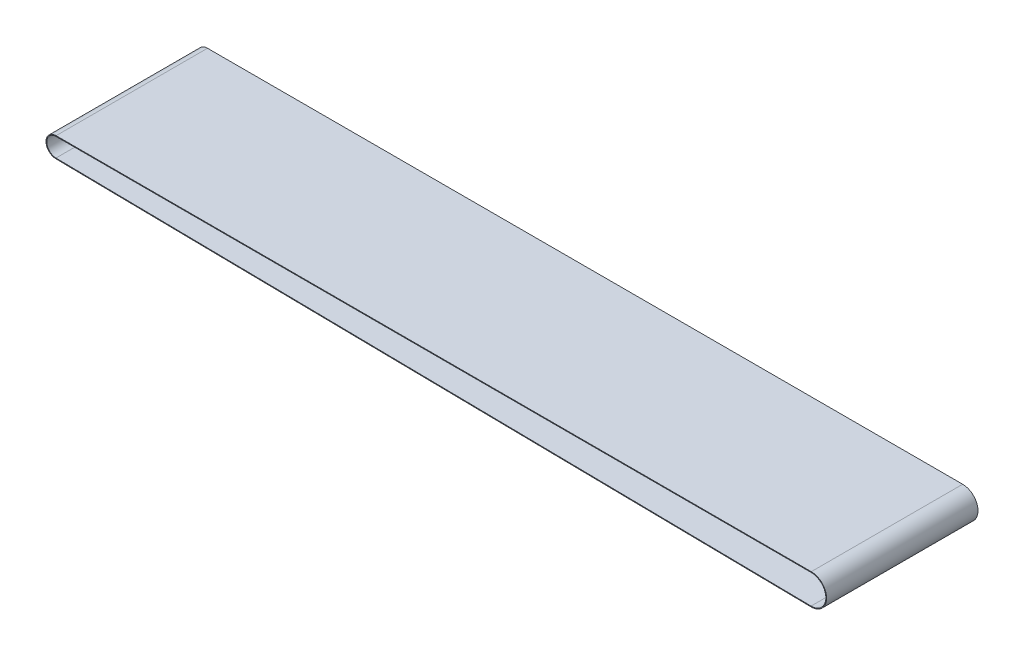
ISO-10303-21;
HEADER;
FILE_DESCRIPTION(('STEP AP214'),'2;1');
FILE_NAME('part.step','',(''),(''),'','','');
FILE_SCHEMA(('AUTOMOTIVE_DESIGN { 1 0 10303 214 1 1 1 1 }'));
ENDSEC;
DATA;
#1=APPLICATION_CONTEXT('core data for automotive mechanical design processes');
#2=APPLICATION_PROTOCOL_DEFINITION('international standard','automotive_design',2000,#1);
#3=PRODUCT_CONTEXT('',#1,'mechanical');
#4=PRODUCT('Part','Part','',(#3));
#5=PRODUCT_RELATED_PRODUCT_CATEGORY('part','',(#4));
#6=PRODUCT_DEFINITION_FORMATION('','',#4);
#7=PRODUCT_DEFINITION_CONTEXT('part definition',#1,'design');
#8=PRODUCT_DEFINITION('design','',#6,#7);
#9=PRODUCT_DEFINITION_SHAPE('','',#8);
#10=(LENGTH_UNIT() NAMED_UNIT(*) SI_UNIT(.MILLI.,.METRE.));
#11=(NAMED_UNIT(*) PLANE_ANGLE_UNIT() SI_UNIT($,.RADIAN.));
#12=(NAMED_UNIT(*) SI_UNIT($,.STERADIAN.) SOLID_ANGLE_UNIT());
#13=UNCERTAINTY_MEASURE_WITH_UNIT(LENGTH_MEASURE(1.E-05),#10,'distance_accuracy_value','');
#14=(GEOMETRIC_REPRESENTATION_CONTEXT(3) GLOBAL_UNCERTAINTY_ASSIGNED_CONTEXT((#13)) GLOBAL_UNIT_ASSIGNED_CONTEXT((#10,
#11,#12)) REPRESENTATION_CONTEXT('',''));
#15=CARTESIAN_POINT('',(0.,0.,0.));
#16=DIRECTION('',(0.,0.,1.));
#17=DIRECTION('',(1.,0.,0.));
#18=AXIS2_PLACEMENT_3D('',#15,#16,#17);
#19=CARTESIAN_POINT('',(-4.35633408686631E-10,178.,0.));
#20=DIRECTION('',(0.,0.,1.));
#21=DIRECTION('',(1.,0.,0.));
#22=AXIS2_PLACEMENT_3D('',#19,#20,#21);
#23=CYLINDRICAL_SURFACE('',#22,38.999999999997);
#24=DIRECTION('',(0.,0.,-1.));
#25=VECTOR('',#24,1.);
#26=CARTESIAN_POINT('',(-0.540568093483351,139.003746511536,0.));
#27=LINE('',#26,#25);
#28=CARTESIAN_POINT('',(-0.540568093483351,139.003746511536,202.5));
#29=VERTEX_POINT('',#28);
#30=CARTESIAN_POINT('',(-0.540568093483351,139.003746511536,-202.5));
#31=VERTEX_POINT('',#30);
#32=EDGE_CURVE('E198',#29,#31,#27,.T.);
#33=ORIENTED_EDGE('',*,*,#32,.F.);
#34=CARTESIAN_POINT('',(-4.35633408686631E-10,178.,202.5));
#35=DIRECTION('',(0.,0.,1.));
#36=DIRECTION('',(1.,0.,0.));
#37=AXIS2_PLACEMENT_3D('',#34,#35,#36);
#38=CIRCLE('',#37,38.9999999999969);
#39=CARTESIAN_POINT('',(0.,216.999999999994,202.5));
#40=VERTEX_POINT('',#39);
#41=EDGE_CURVE('E49',#29,#40,#38,.T.);
#42=ORIENTED_EDGE('',*,*,#41,.T.);
#43=CARTESIAN_POINT('',(2.30992522973798E-13,216.999999999997,202.5));
#44=DIRECTION('',(0.,0.,-1.));
#45=VECTOR('',#44,1.);
#46=LINE('',#43,#45);
#47=CARTESIAN_POINT('',(0.,216.999999999994,0.));
#48=VERTEX_POINT('',#47);
#49=EDGE_CURVE('E194',#40,#48,#46,.T.);
#50=ORIENTED_EDGE('',*,*,#49,.T.);
#51=CARTESIAN_POINT('',(2.30992522973798E-13,216.999999999997,0.));
#52=DIRECTION('',(0.,0.,-1.));
#53=VECTOR('',#52,1.);
#54=LINE('',#51,#53);
#55=CARTESIAN_POINT('',(2.34621350125863E-13,216.999999999997,-202.5));
#56=VERTEX_POINT('',#55);
#57=EDGE_CURVE('E149',#48,#56,#54,.T.);
#58=ORIENTED_EDGE('',*,*,#57,.T.);
#59=CARTESIAN_POINT('',(-4.35633408686631E-10,178.,-202.5));
#60=DIRECTION('',(0.,0.,1.));
#61=DIRECTION('',(1.,0.,0.));
#62=AXIS2_PLACEMENT_3D('',#59,#60,#61);
#63=CIRCLE('',#62,38.999999999997);
#64=EDGE_CURVE('E11',#31,#56,#63,.T.);
#65=ORIENTED_EDGE('',*,*,#64,.F.);
#66=EDGE_LOOP('',(#33,#42,#50,#58,#65));
#67=FACE_BOUND('',#66,.T.);
#68=ADVANCED_FACE('F38',(#67),#23,.F.);
#69=CARTESIAN_POINT('',(-4.35633408686631E-10,178.,0.));
#70=DIRECTION('',(0.,0.,1.));
#71=DIRECTION('',(1.,0.,0.));
#72=AXIS2_PLACEMENT_3D('',#69,#70,#71);
#73=CYLINDRICAL_SURFACE('',#72,40.999999999997);
#74=DIRECTION('',(0.,0.,1.));
#75=VECTOR('',#74,1.);
#76=CARTESIAN_POINT('',(-0.56828953417476,137.003938640333,-202.5));
#77=LINE('',#76,#75);
#78=CARTESIAN_POINT('',(-0.56828953417476,137.003938640333,-202.5));
#79=VERTEX_POINT('',#78);
#80=CARTESIAN_POINT('',(-0.56828953417476,137.003938640333,202.5));
#81=VERTEX_POINT('',#80);
#82=EDGE_CURVE('E338',#79,#81,#77,.T.);
#83=ORIENTED_EDGE('',*,*,#82,.F.);
#84=CARTESIAN_POINT('',(-4.35633408686631E-10,178.,-202.5));
#85=DIRECTION('',(0.,0.,1.));
#86=DIRECTION('',(1.,0.,0.));
#87=AXIS2_PLACEMENT_3D('',#84,#85,#86);
#88=CIRCLE('',#87,40.999999999997);
#89=CARTESIAN_POINT('',(4.48811994513409E-11,218.999999999997,-202.5));
#90=VERTEX_POINT('',#89);
#91=EDGE_CURVE('E65',#79,#90,#88,.T.);
#92=ORIENTED_EDGE('',*,*,#91,.T.);
#93=CARTESIAN_POINT('',(4.48782898337431E-11,218.999999999997,-202.5));
#94=DIRECTION('',(0.,0.,1.));
#95=VECTOR('',#94,1.);
#96=LINE('',#93,#95);
#97=CARTESIAN_POINT('',(0.,218.999999999994,202.5));
#98=VERTEX_POINT('',#97);
#99=EDGE_CURVE('E134',#90,#98,#96,.T.);
#100=ORIENTED_EDGE('',*,*,#99,.T.);
#101=CARTESIAN_POINT('',(-4.35633408686631E-10,178.,202.5));
#102=DIRECTION('',(0.,0.,1.));
#103=DIRECTION('',(1.,0.,0.));
#104=AXIS2_PLACEMENT_3D('',#101,#102,#103);
#105=CIRCLE('',#104,40.999999999997);
#106=EDGE_CURVE('E200',#81,#98,#105,.T.);
#107=ORIENTED_EDGE('',*,*,#106,.F.);
#108=EDGE_LOOP('',(#83,#92,#100,#107));
#109=FACE_BOUND('',#108,.T.);
#110=ADVANCED_FACE('F215',(#109),#73,.T.);
#111=CARTESIAN_POINT('',(-2020.34651800864,167.002401609964,0.));
#112=DIRECTION('',(-0.0138607203457564,-0.999903935601564,0.));
#113=DIRECTION('',(0.999903935601564,-0.0138607203457564,0.));
#114=AXIS2_PLACEMENT_3D('',#111,#112,#113);
#115=PLANE('',#114);
#116=DIRECTION('',(0.,0.,-1.));
#117=VECTOR('',#116,1.);
#118=CARTESIAN_POINT('',(-2020.34651800864,167.002401609964,0.));
#119=LINE('',#118,#117);
#120=CARTESIAN_POINT('',(-2020.34651800864,167.002401609964,202.5));
#121=VERTEX_POINT('',#120);
#122=CARTESIAN_POINT('',(-2020.34651800864,167.002401609964,-202.5));
#123=VERTEX_POINT('',#122);
#124=EDGE_CURVE('E123',#121,#123,#119,.T.);
#125=ORIENTED_EDGE('',*,*,#124,.F.);
#126=DIRECTION('',(0.999903935601564,-0.0138607203457564,0.));
#127=VECTOR('',#126,1.);
#128=CARTESIAN_POINT('',(-2020.34651800864,167.002401609964,202.5));
#129=LINE('',#128,#127);
#130=EDGE_CURVE('E343',#121,#29,#129,.T.);
#131=ORIENTED_EDGE('',*,*,#130,.T.);
#132=ORIENTED_EDGE('',*,*,#32,.T.);
#133=DIRECTION('',(0.999903935601564,-0.0138607203457564,0.));
#134=VECTOR('',#133,1.);
#135=CARTESIAN_POINT('',(-2020.34651800864,167.002401609964,-202.5));
#136=LINE('',#135,#134);
#137=EDGE_CURVE('E355',#123,#31,#136,.T.);
#138=ORIENTED_EDGE('',*,*,#137,.F.);
#139=EDGE_LOOP('',(#125,#131,#132,#138));
#140=FACE_BOUND('',#139,.T.);
#141=ADVANCED_FACE('F224',(#140),#115,.F.);
#142=CARTESIAN_POINT('',(-2020.37423944934,165.002593738761,-202.5));
#143=DIRECTION('',(0.0138607203457564,0.999903935601564,0.));
#144=DIRECTION('',(-0.999903935601564,0.0138607203457564,0.));
#145=AXIS2_PLACEMENT_3D('',#142,#143,#144);
#146=PLANE('',#145);
#147=DIRECTION('',(0.,0.,1.));
#148=VECTOR('',#147,1.);
#149=CARTESIAN_POINT('',(-2020.37423944934,165.002593738761,-202.5));
#150=LINE('',#149,#148);
#151=CARTESIAN_POINT('',(-2020.37423944934,165.002593738761,-202.5));
#152=VERTEX_POINT('',#151);
#153=CARTESIAN_POINT('',(-2020.37423944934,165.002593738761,202.5));
#154=VERTEX_POINT('',#153);
#155=EDGE_CURVE('E340',#152,#154,#150,.T.);
#156=ORIENTED_EDGE('',*,*,#155,.F.);
#157=DIRECTION('',(0.999903935601564,-0.0138607203457564,0.));
#158=VECTOR('',#157,1.);
#159=CARTESIAN_POINT('',(-2020.37423944934,165.002593738761,-202.5));
#160=LINE('',#159,#158);
#161=EDGE_CURVE('E118',#152,#79,#160,.T.);
#162=ORIENTED_EDGE('',*,*,#161,.T.);
#163=ORIENTED_EDGE('',*,*,#82,.T.);
#164=DIRECTION('',(0.999903935601564,-0.0138607203457564,0.));
#165=VECTOR('',#164,1.);
#166=CARTESIAN_POINT('',(-2020.37423944934,165.002593738761,202.5));
#167=LINE('',#166,#165);
#168=EDGE_CURVE('E351',#154,#81,#167,.T.);
#169=ORIENTED_EDGE('',*,*,#168,.F.);
#170=EDGE_LOOP('',(#156,#162,#163,#169));
#171=FACE_BOUND('',#170,.T.);
#172=ADVANCED_FACE('F227',(#171),#146,.F.);
#173=CARTESIAN_POINT('',(-2020.,192.,0.));
#174=DIRECTION('',(0.,0.,1.));
#175=DIRECTION('',(1.,0.,0.));
#176=AXIS2_PLACEMENT_3D('',#173,#174,#175);
#177=CYLINDRICAL_SURFACE('',#176,24.999999999997);
#178=DIRECTION('',(0.,0.,-1.));
#179=VECTOR('',#178,1.);
#180=CARTESIAN_POINT('',(-2020.,216.999999999997,0.));
#181=LINE('',#180,#179);
#182=CARTESIAN_POINT('',(-2020.,216.999999999997,202.5));
#183=VERTEX_POINT('',#182);
#184=CARTESIAN_POINT('',(-2020.,216.999999999997,-202.5));
#185=VERTEX_POINT('',#184);
#186=EDGE_CURVE('E131',#183,#185,#181,.T.);
#187=ORIENTED_EDGE('',*,*,#186,.F.);
#188=CARTESIAN_POINT('',(-2020.,192.,202.5));
#189=DIRECTION('',(0.,0.,1.));
#190=DIRECTION('',(1.,0.,0.));
#191=AXIS2_PLACEMENT_3D('',#188,#189,#190);
#192=CIRCLE('',#191,24.9999999999969);
#193=EDGE_CURVE('E332',#183,#121,#192,.T.);
#194=ORIENTED_EDGE('',*,*,#193,.T.);
#195=ORIENTED_EDGE('',*,*,#124,.T.);
#196=CARTESIAN_POINT('',(-2020.,192.,-202.5));
#197=DIRECTION('',(0.,0.,1.));
#198=DIRECTION('',(1.,0.,0.));
#199=AXIS2_PLACEMENT_3D('',#196,#197,#198);
#200=CIRCLE('',#199,24.999999999997);
#201=EDGE_CURVE('E334',#185,#123,#200,.T.);
#202=ORIENTED_EDGE('',*,*,#201,.F.);
#203=EDGE_LOOP('',(#187,#194,#195,#202));
#204=FACE_BOUND('',#203,.T.);
#205=ADVANCED_FACE('F231',(#204),#177,.F.);
#206=CARTESIAN_POINT('',(-2020.,192.,0.));
#207=DIRECTION('',(0.,0.,1.));
#208=DIRECTION('',(1.,0.,0.));
#209=AXIS2_PLACEMENT_3D('',#206,#207,#208);
#210=CYLINDRICAL_SURFACE('',#209,26.999999999997);
#211=DIRECTION('',(0.,0.,1.));
#212=VECTOR('',#211,1.);
#213=CARTESIAN_POINT('',(-2020.,218.999999999997,-202.5));
#214=LINE('',#213,#212);
#215=CARTESIAN_POINT('',(-2020.,218.999999999997,-202.5));
#216=VERTEX_POINT('',#215);
#217=CARTESIAN_POINT('',(-2020.,218.999999999997,202.5));
#218=VERTEX_POINT('',#217);
#219=EDGE_CURVE('E126',#216,#218,#214,.T.);
#220=ORIENTED_EDGE('',*,*,#219,.F.);
#221=CARTESIAN_POINT('',(-2020.,192.,-202.5));
#222=DIRECTION('',(0.,0.,1.));
#223=DIRECTION('',(1.,0.,0.));
#224=AXIS2_PLACEMENT_3D('',#221,#222,#223);
#225=CIRCLE('',#224,26.999999999997);
#226=EDGE_CURVE('E110',#216,#152,#225,.T.);
#227=ORIENTED_EDGE('',*,*,#226,.T.);
#228=ORIENTED_EDGE('',*,*,#155,.T.);
#229=CARTESIAN_POINT('',(-2020.,192.,202.5));
#230=DIRECTION('',(0.,0.,1.));
#231=DIRECTION('',(1.,0.,0.));
#232=AXIS2_PLACEMENT_3D('',#229,#230,#231);
#233=CIRCLE('',#232,26.9999999999969);
#234=EDGE_CURVE('E122',#218,#154,#233,.T.);
#235=ORIENTED_EDGE('',*,*,#234,.F.);
#236=EDGE_LOOP('',(#220,#227,#228,#235));
#237=FACE_BOUND('',#236,.T.);
#238=ADVANCED_FACE('F127',(#237),#210,.T.);
#239=CARTESIAN_POINT('',(-2020.,218.999999999997,-202.5));
#240=DIRECTION('',(0.,0.,-1.));
#241=DIRECTION('',(-1.,0.,0.));
#242=AXIS2_PLACEMENT_3D('',#239,#240,#241);
#243=PLANE('',#242);
#244=ORIENTED_EDGE('',*,*,#226,.F.);
#245=DIRECTION('',(1.,0.,0.));
#246=VECTOR('',#245,1.);
#247=CARTESIAN_POINT('',(-2020.,218.999999999997,-202.5));
#248=LINE('',#247,#246);
#249=EDGE_CURVE('E115',#216,#90,#248,.T.);
#250=ORIENTED_EDGE('',*,*,#249,.T.);
#251=ORIENTED_EDGE('',*,*,#91,.F.);
#252=ORIENTED_EDGE('',*,*,#161,.F.);
#253=EDGE_LOOP('',(#244,#250,#251,#252));
#254=FACE_BOUND('',#253,.T.);
#255=DIRECTION('',(1.,0.,0.));
#256=VECTOR('',#255,1.);
#257=CARTESIAN_POINT('',(-2020.,216.999999999997,-202.5));
#258=LINE('',#257,#256);
#259=EDGE_CURVE('E57',#185,#56,#258,.T.);
#260=ORIENTED_EDGE('',*,*,#259,.F.);
#261=ORIENTED_EDGE('',*,*,#201,.T.);
#262=ORIENTED_EDGE('',*,*,#137,.T.);
#263=ORIENTED_EDGE('',*,*,#64,.T.);
#264=EDGE_LOOP('',(#260,#261,#262,#263));
#265=FACE_BOUND('',#264,.T.);
#266=ADVANCED_FACE('F112',(#254,#265),#243,.T.);
#267=CARTESIAN_POINT('',(-2020.,216.999999999997,-202.5));
#268=DIRECTION('',(0.,-1.,0.));
#269=DIRECTION('',(1.,0.,0.));
#270=AXIS2_PLACEMENT_3D('',#267,#268,#269);
#271=PLANE('',#270);
#272=ORIENTED_EDGE('',*,*,#57,.F.);
#273=ORIENTED_EDGE('',*,*,#49,.F.);
#274=DIRECTION('',(1.,0.,0.));
#275=VECTOR('',#274,1.);
#276=CARTESIAN_POINT('',(-2020.,216.999999999997,202.5));
#277=LINE('',#276,#275);
#278=EDGE_CURVE('E138',#183,#40,#277,.T.);
#279=ORIENTED_EDGE('',*,*,#278,.F.);
#280=ORIENTED_EDGE('',*,*,#186,.T.);
#281=ORIENTED_EDGE('',*,*,#259,.T.);
#282=EDGE_LOOP('',(#272,#273,#279,#280,#281));
#283=FACE_BOUND('',#282,.T.);
#284=ADVANCED_FACE('F155',(#283),#271,.T.);
#285=CARTESIAN_POINT('',(-2020.,218.999999999997,202.5));
#286=DIRECTION('',(0.,0.,1.));
#287=DIRECTION('',(1.,0.,0.));
#288=AXIS2_PLACEMENT_3D('',#285,#286,#287);
#289=PLANE('',#288);
#290=ORIENTED_EDGE('',*,*,#193,.F.);
#291=ORIENTED_EDGE('',*,*,#278,.T.);
#292=ORIENTED_EDGE('',*,*,#41,.F.);
#293=ORIENTED_EDGE('',*,*,#130,.F.);
#294=EDGE_LOOP('',(#290,#291,#292,#293));
#295=FACE_BOUND('',#294,.T.);
#296=DIRECTION('',(1.,0.,0.));
#297=VECTOR('',#296,1.);
#298=CARTESIAN_POINT('',(-2020.,218.999999999997,202.5));
#299=LINE('',#298,#297);
#300=EDGE_CURVE('E136',#218,#98,#299,.T.);
#301=ORIENTED_EDGE('',*,*,#300,.F.);
#302=ORIENTED_EDGE('',*,*,#234,.T.);
#303=ORIENTED_EDGE('',*,*,#168,.T.);
#304=ORIENTED_EDGE('',*,*,#106,.T.);
#305=EDGE_LOOP('',(#301,#302,#303,#304));
#306=FACE_BOUND('',#305,.T.);
#307=ADVANCED_FACE('F164',(#295,#306),#289,.T.);
#308=CARTESIAN_POINT('',(-2020.,218.999999999997,-202.5));
#309=DIRECTION('',(0.,1.,0.));
#310=DIRECTION('',(-1.,0.,0.));
#311=AXIS2_PLACEMENT_3D('',#308,#309,#310);
#312=PLANE('',#311);
#313=ORIENTED_EDGE('',*,*,#99,.F.);
#314=ORIENTED_EDGE('',*,*,#249,.F.);
#315=ORIENTED_EDGE('',*,*,#219,.T.);
#316=ORIENTED_EDGE('',*,*,#300,.T.);
#317=EDGE_LOOP('',(#313,#314,#315,#316));
#318=FACE_BOUND('',#317,.T.);
#319=ADVANCED_FACE('F133',(#318),#312,.T.);
#320=CLOSED_SHELL('',(#68,#110,#141,#172,#205,#238,#266,#284,#307,#319));
#321=MANIFOLD_SOLID_BREP('B2',#320);
#322=ADVANCED_BREP_SHAPE_REPRESENTATION('',(#18,#321),#14);
#323=SHAPE_DEFINITION_REPRESENTATION(#9,#322);
ENDSEC;
END-ISO-10303-21;
